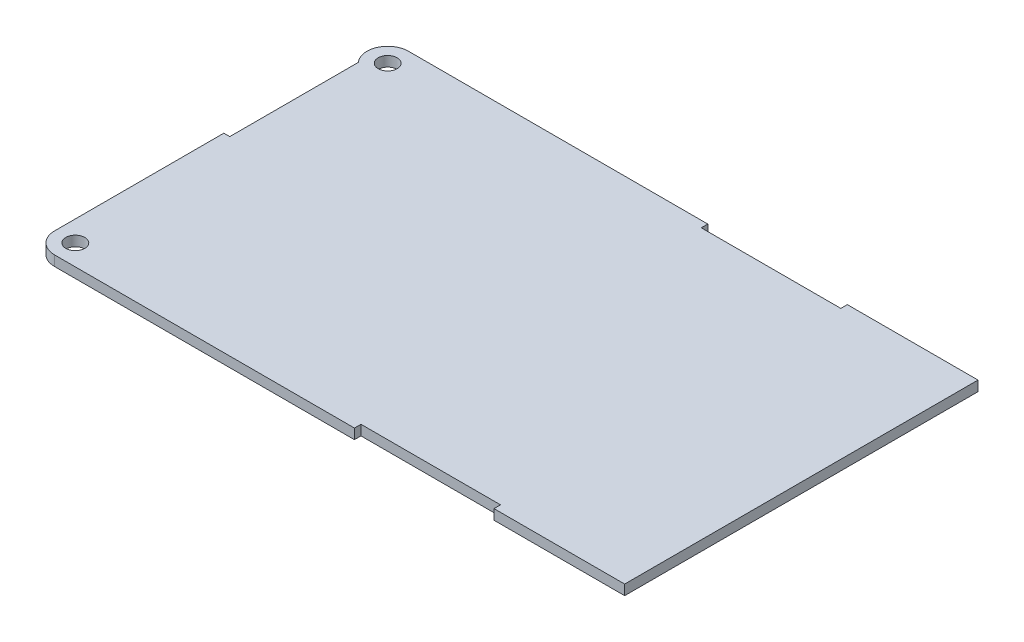
ISO-10303-21;
HEADER;
FILE_DESCRIPTION(('STEP AP214'),'2;1');
FILE_NAME('part.step','',(''),(''),'','','');
FILE_SCHEMA(('AUTOMOTIVE_DESIGN { 1 0 10303 214 1 1 1 1 }'));
ENDSEC;
DATA;
#1=APPLICATION_CONTEXT('core data for automotive mechanical design processes');
#2=APPLICATION_PROTOCOL_DEFINITION('international standard','automotive_design',2000,#1);
#3=PRODUCT_CONTEXT('',#1,'mechanical');
#4=PRODUCT('Part','Part','',(#3));
#5=PRODUCT_RELATED_PRODUCT_CATEGORY('part','',(#4));
#6=PRODUCT_DEFINITION_FORMATION('','',#4);
#7=PRODUCT_DEFINITION_CONTEXT('part definition',#1,'design');
#8=PRODUCT_DEFINITION('design','',#6,#7);
#9=PRODUCT_DEFINITION_SHAPE('','',#8);
#10=(LENGTH_UNIT() NAMED_UNIT(*) SI_UNIT(.MILLI.,.METRE.));
#11=(NAMED_UNIT(*) PLANE_ANGLE_UNIT() SI_UNIT($,.RADIAN.));
#12=(NAMED_UNIT(*) SI_UNIT($,.STERADIAN.) SOLID_ANGLE_UNIT());
#13=UNCERTAINTY_MEASURE_WITH_UNIT(LENGTH_MEASURE(1.E-05),#10,'distance_accuracy_value','');
#14=(GEOMETRIC_REPRESENTATION_CONTEXT(3) GLOBAL_UNCERTAINTY_ASSIGNED_CONTEXT((#13)) GLOBAL_UNIT_ASSIGNED_CONTEXT((#10,
#11,#12)) REPRESENTATION_CONTEXT('',''));
#15=CARTESIAN_POINT('',(0.,0.,0.));
#16=DIRECTION('',(0.,0.,1.));
#17=DIRECTION('',(1.,0.,0.));
#18=AXIS2_PLACEMENT_3D('',#15,#16,#17);
#19=CARTESIAN_POINT('',(0.,1.7,-59.5));
#20=DIRECTION('',(0.,0.,-1.));
#21=DIRECTION('',(-1.,0.,0.));
#22=AXIS2_PLACEMENT_3D('',#19,#20,#21);
#23=PLANE('',#22);
#24=DIRECTION('',(1.,0.,0.));
#25=VECTOR('',#24,1.);
#26=CARTESIAN_POINT('',(0.,0.,-59.5));
#27=LINE('',#26,#25);
#28=CARTESIAN_POINT('',(3.6,0.,-59.5));
#29=VERTEX_POINT('',#28);
#30=CARTESIAN_POINT('',(54.,0.,-59.5));
#31=VERTEX_POINT('',#30);
#32=EDGE_CURVE('E221',#29,#31,#27,.T.);
#33=ORIENTED_EDGE('',*,*,#32,.F.);
#34=DIRECTION('',(0.,-1.,0.));
#35=VECTOR('',#34,1.);
#36=CARTESIAN_POINT('',(3.6,1.7,-59.5));
#37=LINE('',#36,#35);
#38=CARTESIAN_POINT('',(3.6,1.7,-59.5));
#39=VERTEX_POINT('',#38);
#40=EDGE_CURVE('E11',#39,#29,#37,.T.);
#41=ORIENTED_EDGE('',*,*,#40,.F.);
#42=DIRECTION('',(1.,0.,0.));
#43=VECTOR('',#42,1.);
#44=CARTESIAN_POINT('',(0.,1.7,-59.5));
#45=LINE('',#44,#43);
#46=CARTESIAN_POINT('',(54.,1.7,-59.5));
#47=VERTEX_POINT('',#46);
#48=EDGE_CURVE('E348',#39,#47,#45,.T.);
#49=ORIENTED_EDGE('',*,*,#48,.T.);
#50=DIRECTION('',(0.,-1.,0.));
#51=VECTOR('',#50,1.);
#52=CARTESIAN_POINT('',(54.,1.7,-59.5));
#53=LINE('',#52,#51);
#54=EDGE_CURVE('E111',#47,#31,#53,.T.);
#55=ORIENTED_EDGE('',*,*,#54,.T.);
#56=EDGE_LOOP('',(#33,#41,#49,#55));
#57=FACE_BOUND('',#56,.T.);
#58=ADVANCED_FACE('F36',(#57),#23,.T.);
#59=CARTESIAN_POINT('',(3.6,1.7,-56.));
#60=DIRECTION('',(0.,-1.,0.));
#61=DIRECTION('',(0.,0.,-1.));
#62=AXIS2_PLACEMENT_3D('',#59,#60,#61);
#63=CYLINDRICAL_SURFACE('',#62,3.5);
#64=CARTESIAN_POINT('',(3.6,0.,-56.));
#65=DIRECTION('',(0.,1.,0.));
#66=DIRECTION('',(0.,0.,1.));
#67=AXIS2_PLACEMENT_3D('',#64,#65,#66);
#68=CIRCLE('',#67,3.5);
#69=CARTESIAN_POINT('',(1.,0.,-53.656925097228));
#70=VERTEX_POINT('',#69);
#71=EDGE_CURVE('E219',#29,#70,#68,.T.);
#72=ORIENTED_EDGE('',*,*,#71,.T.);
#73=DIRECTION('',(0.,-1.,0.));
#74=VECTOR('',#73,1.);
#75=CARTESIAN_POINT('',(1.,1.7,-53.656925097228));
#76=LINE('',#75,#74);
#77=CARTESIAN_POINT('',(1.,1.7,-53.656925097228));
#78=VERTEX_POINT('',#77);
#79=EDGE_CURVE('E45',#78,#70,#76,.T.);
#80=ORIENTED_EDGE('',*,*,#79,.F.);
#81=CARTESIAN_POINT('',(3.6,1.7,-56.));
#82=DIRECTION('',(0.,1.,0.));
#83=DIRECTION('',(0.,0.,1.));
#84=AXIS2_PLACEMENT_3D('',#81,#82,#83);
#85=CIRCLE('',#84,3.5);
#86=EDGE_CURVE('E350',#39,#78,#85,.T.);
#87=ORIENTED_EDGE('',*,*,#86,.F.);
#88=ORIENTED_EDGE('',*,*,#40,.T.);
#89=EDGE_LOOP('',(#72,#80,#87,#88));
#90=FACE_BOUND('',#89,.T.);
#91=ADVANCED_FACE('F220',(#90),#63,.T.);
#92=CARTESIAN_POINT('',(1.00000000000001,1.7,0.));
#93=DIRECTION('',(1.,0.,0.));
#94=DIRECTION('',(0.,0.,-1.));
#95=AXIS2_PLACEMENT_3D('',#92,#93,#94);
#96=PLANE('',#95);
#97=DIRECTION('',(0.,0.,1.));
#98=VECTOR('',#97,1.);
#99=CARTESIAN_POINT('',(1.00000000000001,0.,0.));
#100=LINE('',#99,#98);
#101=CARTESIAN_POINT('',(1.,0.,-32.));
#102=VERTEX_POINT('',#101);
#103=EDGE_CURVE('E213',#70,#102,#100,.T.);
#104=ORIENTED_EDGE('',*,*,#103,.T.);
#105=DIRECTION('',(0.,-1.,0.));
#106=VECTOR('',#105,1.);
#107=CARTESIAN_POINT('',(1.,1.7,-32.));
#108=LINE('',#107,#106);
#109=CARTESIAN_POINT('',(1.,1.7,-32.));
#110=VERTEX_POINT('',#109);
#111=EDGE_CURVE('E204',#110,#102,#108,.T.);
#112=ORIENTED_EDGE('',*,*,#111,.F.);
#113=DIRECTION('',(0.,0.,1.));
#114=VECTOR('',#113,1.);
#115=CARTESIAN_POINT('',(1.00000000000001,1.7,0.));
#116=LINE('',#115,#114);
#117=EDGE_CURVE('E215',#78,#110,#116,.T.);
#118=ORIENTED_EDGE('',*,*,#117,.F.);
#119=ORIENTED_EDGE('',*,*,#79,.T.);
#120=EDGE_LOOP('',(#104,#112,#118,#119));
#121=FACE_BOUND('',#120,.T.);
#122=ADVANCED_FACE('F211',(#121),#96,.F.);
#123=CARTESIAN_POINT('',(0.,1.7,-32.));
#124=DIRECTION('',(0.,0.,1.));
#125=DIRECTION('',(1.,0.,0.));
#126=AXIS2_PLACEMENT_3D('',#123,#124,#125);
#127=PLANE('',#126);
#128=DIRECTION('',(-1.,0.,0.));
#129=VECTOR('',#128,1.);
#130=CARTESIAN_POINT('',(0.,0.,-32.));
#131=LINE('',#130,#129);
#132=CARTESIAN_POINT('',(0.,0.,-32.));
#133=VERTEX_POINT('',#132);
#134=EDGE_CURVE('E223',#102,#133,#131,.T.);
#135=ORIENTED_EDGE('',*,*,#134,.T.);
#136=DIRECTION('',(0.,-1.,0.));
#137=VECTOR('',#136,1.);
#138=CARTESIAN_POINT('',(0.,1.7,-32.));
#139=LINE('',#138,#137);
#140=CARTESIAN_POINT('',(0.,1.7,-32.));
#141=VERTEX_POINT('',#140);
#142=EDGE_CURVE('E202',#141,#133,#139,.T.);
#143=ORIENTED_EDGE('',*,*,#142,.F.);
#144=DIRECTION('',(-1.,0.,0.));
#145=VECTOR('',#144,1.);
#146=CARTESIAN_POINT('',(0.,1.7,-32.));
#147=LINE('',#146,#145);
#148=EDGE_CURVE('E356',#110,#141,#147,.T.);
#149=ORIENTED_EDGE('',*,*,#148,.F.);
#150=ORIENTED_EDGE('',*,*,#111,.T.);
#151=EDGE_LOOP('',(#135,#143,#149,#150));
#152=FACE_BOUND('',#151,.T.);
#153=ADVANCED_FACE('F291',(#152),#127,.F.);
#154=CARTESIAN_POINT('',(0.,1.7,0.));
#155=DIRECTION('',(-1.,0.,0.));
#156=DIRECTION('',(0.,0.,1.));
#157=AXIS2_PLACEMENT_3D('',#154,#155,#156);
#158=PLANE('',#157);
#159=DIRECTION('',(0.,0.,-1.));
#160=VECTOR('',#159,1.);
#161=CARTESIAN_POINT('',(0.,0.,0.));
#162=LINE('',#161,#160);
#163=CARTESIAN_POINT('',(0.,0.,-3.50000000000002));
#164=VERTEX_POINT('',#163);
#165=EDGE_CURVE('E231',#164,#133,#162,.T.);
#166=ORIENTED_EDGE('',*,*,#165,.F.);
#167=DIRECTION('',(0.,-1.,0.));
#168=VECTOR('',#167,1.);
#169=CARTESIAN_POINT('',(0.,1.7,-3.50000000000002));
#170=LINE('',#169,#168);
#171=CARTESIAN_POINT('',(0.,1.7,-3.50000000000002));
#172=VERTEX_POINT('',#171);
#173=EDGE_CURVE('E200',#172,#164,#170,.T.);
#174=ORIENTED_EDGE('',*,*,#173,.F.);
#175=DIRECTION('',(0.,0.,-1.));
#176=VECTOR('',#175,1.);
#177=CARTESIAN_POINT('',(0.,1.7,0.));
#178=LINE('',#177,#176);
#179=EDGE_CURVE('E358',#172,#141,#178,.T.);
#180=ORIENTED_EDGE('',*,*,#179,.T.);
#181=ORIENTED_EDGE('',*,*,#142,.T.);
#182=EDGE_LOOP('',(#166,#174,#180,#181));
#183=FACE_BOUND('',#182,.T.);
#184=ADVANCED_FACE('F294',(#183),#158,.T.);
#185=CARTESIAN_POINT('',(3.5,1.7,-3.5));
#186=DIRECTION('',(0.,-1.,0.));
#187=DIRECTION('',(0.,0.,-1.));
#188=AXIS2_PLACEMENT_3D('',#185,#186,#187);
#189=CYLINDRICAL_SURFACE('',#188,3.5);
#190=CARTESIAN_POINT('',(3.5,0.,-3.5));
#191=DIRECTION('',(0.,1.,0.));
#192=DIRECTION('',(0.,0.,1.));
#193=AXIS2_PLACEMENT_3D('',#190,#191,#192);
#194=CIRCLE('',#193,3.5);
#195=CARTESIAN_POINT('',(3.50000000000002,0.,0.));
#196=VERTEX_POINT('',#195);
#197=EDGE_CURVE('E234',#196,#164,#194,.F.);
#198=ORIENTED_EDGE('',*,*,#197,.F.);
#199=DIRECTION('',(0.,-1.,0.));
#200=VECTOR('',#199,1.);
#201=CARTESIAN_POINT('',(3.50000000000002,1.7,0.));
#202=LINE('',#201,#200);
#203=CARTESIAN_POINT('',(3.50000000000002,1.7,0.));
#204=VERTEX_POINT('',#203);
#205=EDGE_CURVE('E198',#204,#196,#202,.T.);
#206=ORIENTED_EDGE('',*,*,#205,.F.);
#207=CARTESIAN_POINT('',(3.5,1.7,-3.5));
#208=DIRECTION('',(0.,1.,0.));
#209=DIRECTION('',(0.,0.,1.));
#210=AXIS2_PLACEMENT_3D('',#207,#208,#209);
#211=CIRCLE('',#210,3.5);
#212=EDGE_CURVE('E361',#204,#172,#211,.F.);
#213=ORIENTED_EDGE('',*,*,#212,.T.);
#214=ORIENTED_EDGE('',*,*,#173,.T.);
#215=EDGE_LOOP('',(#198,#206,#213,#214));
#216=FACE_BOUND('',#215,.T.);
#217=ADVANCED_FACE('F298',(#216),#189,.T.);
#218=CARTESIAN_POINT('',(0.,1.7,0.));
#219=DIRECTION('',(0.,0.,-1.));
#220=DIRECTION('',(-1.,0.,0.));
#221=AXIS2_PLACEMENT_3D('',#218,#219,#220);
#222=PLANE('',#221);
#223=DIRECTION('',(1.,0.,0.));
#224=VECTOR('',#223,1.);
#225=CARTESIAN_POINT('',(0.,0.,0.));
#226=LINE('',#225,#224);
#227=CARTESIAN_POINT('',(54.,0.,0.));
#228=VERTEX_POINT('',#227);
#229=EDGE_CURVE('E237',#196,#228,#226,.T.);
#230=ORIENTED_EDGE('',*,*,#229,.T.);
#231=DIRECTION('',(0.,-1.,0.));
#232=VECTOR('',#231,1.);
#233=CARTESIAN_POINT('',(54.,1.7,0.));
#234=LINE('',#233,#232);
#235=CARTESIAN_POINT('',(54.,1.7,0.));
#236=VERTEX_POINT('',#235);
#237=EDGE_CURVE('E195',#236,#228,#234,.T.);
#238=ORIENTED_EDGE('',*,*,#237,.F.);
#239=DIRECTION('',(1.,0.,0.));
#240=VECTOR('',#239,1.);
#241=CARTESIAN_POINT('',(0.,1.7,0.));
#242=LINE('',#241,#240);
#243=EDGE_CURVE('E364',#204,#236,#242,.T.);
#244=ORIENTED_EDGE('',*,*,#243,.F.);
#245=ORIENTED_EDGE('',*,*,#205,.T.);
#246=EDGE_LOOP('',(#230,#238,#244,#245));
#247=FACE_BOUND('',#246,.T.);
#248=ADVANCED_FACE('F302',(#247),#222,.F.);
#249=CARTESIAN_POINT('',(54.,1.7,0.));
#250=DIRECTION('',(-1.,0.,0.));
#251=DIRECTION('',(0.,0.,1.));
#252=AXIS2_PLACEMENT_3D('',#249,#250,#251);
#253=PLANE('',#252);
#254=DIRECTION('',(0.,0.,-1.));
#255=VECTOR('',#254,1.);
#256=CARTESIAN_POINT('',(54.,0.,0.));
#257=LINE('',#256,#255);
#258=CARTESIAN_POINT('',(54.,0.,-1.1));
#259=VERTEX_POINT('',#258);
#260=EDGE_CURVE('E240',#228,#259,#257,.T.);
#261=ORIENTED_EDGE('',*,*,#260,.T.);
#262=DIRECTION('',(0.,-1.,0.));
#263=VECTOR('',#262,1.);
#264=CARTESIAN_POINT('',(54.,1.7,-1.1));
#265=LINE('',#264,#263);
#266=CARTESIAN_POINT('',(54.,1.7,-1.1));
#267=VERTEX_POINT('',#266);
#268=EDGE_CURVE('E192',#267,#259,#265,.T.);
#269=ORIENTED_EDGE('',*,*,#268,.F.);
#270=DIRECTION('',(0.,0.,-1.));
#271=VECTOR('',#270,1.);
#272=CARTESIAN_POINT('',(54.,1.7,0.));
#273=LINE('',#272,#271);
#274=EDGE_CURVE('E367',#236,#267,#273,.T.);
#275=ORIENTED_EDGE('',*,*,#274,.F.);
#276=ORIENTED_EDGE('',*,*,#237,.T.);
#277=EDGE_LOOP('',(#261,#269,#275,#276));
#278=FACE_BOUND('',#277,.T.);
#279=ADVANCED_FACE('F306',(#278),#253,.F.);
#280=CARTESIAN_POINT('',(0.,1.7,-1.09999999999999));
#281=DIRECTION('',(0.,0.,-1.));
#282=DIRECTION('',(-1.,0.,0.));
#283=AXIS2_PLACEMENT_3D('',#280,#281,#282);
#284=PLANE('',#283);
#285=DIRECTION('',(1.,0.,0.));
#286=VECTOR('',#285,1.);
#287=CARTESIAN_POINT('',(0.,0.,-1.09999999999999));
#288=LINE('',#287,#286);
#289=CARTESIAN_POINT('',(77.5,0.,-1.1));
#290=VERTEX_POINT('',#289);
#291=EDGE_CURVE('E243',#259,#290,#288,.T.);
#292=ORIENTED_EDGE('',*,*,#291,.T.);
#293=DIRECTION('',(0.,-1.,0.));
#294=VECTOR('',#293,1.);
#295=CARTESIAN_POINT('',(77.5,1.7,-1.1));
#296=LINE('',#295,#294);
#297=CARTESIAN_POINT('',(77.5,1.7,-1.1));
#298=VERTEX_POINT('',#297);
#299=EDGE_CURVE('E189',#298,#290,#296,.T.);
#300=ORIENTED_EDGE('',*,*,#299,.F.);
#301=DIRECTION('',(1.,0.,0.));
#302=VECTOR('',#301,1.);
#303=CARTESIAN_POINT('',(0.,1.7,-1.09999999999999));
#304=LINE('',#303,#302);
#305=EDGE_CURVE('E370',#267,#298,#304,.T.);
#306=ORIENTED_EDGE('',*,*,#305,.F.);
#307=ORIENTED_EDGE('',*,*,#268,.T.);
#308=EDGE_LOOP('',(#292,#300,#306,#307));
#309=FACE_BOUND('',#308,.T.);
#310=ADVANCED_FACE('F310',(#309),#284,.F.);
#311=CARTESIAN_POINT('',(77.5,1.7,0.));
#312=DIRECTION('',(1.,0.,0.));
#313=DIRECTION('',(0.,0.,-1.));
#314=AXIS2_PLACEMENT_3D('',#311,#312,#313);
#315=PLANE('',#314);
#316=DIRECTION('',(0.,0.,1.));
#317=VECTOR('',#316,1.);
#318=CARTESIAN_POINT('',(77.5,0.,0.));
#319=LINE('',#318,#317);
#320=CARTESIAN_POINT('',(77.5,0.,0.));
#321=VERTEX_POINT('',#320);
#322=EDGE_CURVE('E246',#290,#321,#319,.T.);
#323=ORIENTED_EDGE('',*,*,#322,.T.);
#324=DIRECTION('',(0.,-1.,0.));
#325=VECTOR('',#324,1.);
#326=CARTESIAN_POINT('',(77.5,1.7,0.));
#327=LINE('',#326,#325);
#328=CARTESIAN_POINT('',(77.5,1.7,0.));
#329=VERTEX_POINT('',#328);
#330=EDGE_CURVE('E186',#329,#321,#327,.T.);
#331=ORIENTED_EDGE('',*,*,#330,.F.);
#332=DIRECTION('',(0.,0.,1.));
#333=VECTOR('',#332,1.);
#334=CARTESIAN_POINT('',(77.5,1.7,0.));
#335=LINE('',#334,#333);
#336=EDGE_CURVE('E373',#298,#329,#335,.T.);
#337=ORIENTED_EDGE('',*,*,#336,.F.);
#338=ORIENTED_EDGE('',*,*,#299,.T.);
#339=EDGE_LOOP('',(#323,#331,#337,#338));
#340=FACE_BOUND('',#339,.T.);
#341=ADVANCED_FACE('F314',(#340),#315,.F.);
#342=CARTESIAN_POINT('',(0.,1.7,0.));
#343=DIRECTION('',(0.,0.,-1.));
#344=DIRECTION('',(-1.,0.,0.));
#345=AXIS2_PLACEMENT_3D('',#342,#343,#344);
#346=PLANE('',#345);
#347=DIRECTION('',(1.,0.,0.));
#348=VECTOR('',#347,1.);
#349=CARTESIAN_POINT('',(0.,0.,0.));
#350=LINE('',#349,#348);
#351=CARTESIAN_POINT('',(99.5,0.,0.));
#352=VERTEX_POINT('',#351);
#353=EDGE_CURVE('E249',#321,#352,#350,.T.);
#354=ORIENTED_EDGE('',*,*,#353,.T.);
#355=DIRECTION('',(0.,-1.,0.));
#356=VECTOR('',#355,1.);
#357=CARTESIAN_POINT('',(99.5,1.7,0.));
#358=LINE('',#357,#356);
#359=CARTESIAN_POINT('',(99.5,1.7,0.));
#360=VERTEX_POINT('',#359);
#361=EDGE_CURVE('E183',#360,#352,#358,.T.);
#362=ORIENTED_EDGE('',*,*,#361,.F.);
#363=DIRECTION('',(1.,0.,0.));
#364=VECTOR('',#363,1.);
#365=CARTESIAN_POINT('',(0.,1.7,0.));
#366=LINE('',#365,#364);
#367=EDGE_CURVE('E376',#329,#360,#366,.T.);
#368=ORIENTED_EDGE('',*,*,#367,.F.);
#369=ORIENTED_EDGE('',*,*,#330,.T.);
#370=EDGE_LOOP('',(#354,#362,#368,#369));
#371=FACE_BOUND('',#370,.T.);
#372=ADVANCED_FACE('F318',(#371),#346,.F.);
#373=CARTESIAN_POINT('',(99.5,1.7,0.));
#374=DIRECTION('',(-1.,0.,0.));
#375=DIRECTION('',(0.,0.,1.));
#376=AXIS2_PLACEMENT_3D('',#373,#374,#375);
#377=PLANE('',#376);
#378=DIRECTION('',(0.,0.,-1.));
#379=VECTOR('',#378,1.);
#380=CARTESIAN_POINT('',(99.5,0.,0.));
#381=LINE('',#380,#379);
#382=CARTESIAN_POINT('',(99.5,0.,-59.5));
#383=VERTEX_POINT('',#382);
#384=EDGE_CURVE('E252',#352,#383,#381,.T.);
#385=ORIENTED_EDGE('',*,*,#384,.T.);
#386=DIRECTION('',(0.,-1.,0.));
#387=VECTOR('',#386,1.);
#388=CARTESIAN_POINT('',(99.5,1.7,-59.5));
#389=LINE('',#388,#387);
#390=CARTESIAN_POINT('',(99.5,1.7,-59.5));
#391=VERTEX_POINT('',#390);
#392=EDGE_CURVE('E177',#391,#383,#389,.T.);
#393=ORIENTED_EDGE('',*,*,#392,.F.);
#394=DIRECTION('',(0.,0.,-1.));
#395=VECTOR('',#394,1.);
#396=CARTESIAN_POINT('',(99.5,1.7,0.));
#397=LINE('',#396,#395);
#398=EDGE_CURVE('E379',#360,#391,#397,.T.);
#399=ORIENTED_EDGE('',*,*,#398,.F.);
#400=ORIENTED_EDGE('',*,*,#361,.T.);
#401=EDGE_LOOP('',(#385,#393,#399,#400));
#402=FACE_BOUND('',#401,.T.);
#403=ADVANCED_FACE('F322',(#402),#377,.F.);
#404=CARTESIAN_POINT('',(0.,1.7,-59.5));
#405=DIRECTION('',(0.,0.,-1.));
#406=DIRECTION('',(-1.,0.,0.));
#407=AXIS2_PLACEMENT_3D('',#404,#405,#406);
#408=PLANE('',#407);
#409=DIRECTION('',(1.,0.,0.));
#410=VECTOR('',#409,1.);
#411=CARTESIAN_POINT('',(0.,0.,-59.5));
#412=LINE('',#411,#410);
#413=CARTESIAN_POINT('',(77.5,0.,-59.5));
#414=VERTEX_POINT('',#413);
#415=EDGE_CURVE('E255',#414,#383,#412,.T.);
#416=ORIENTED_EDGE('',*,*,#415,.F.);
#417=DIRECTION('',(0.,-1.,0.));
#418=VECTOR('',#417,1.);
#419=CARTESIAN_POINT('',(77.5,1.7,-59.5));
#420=LINE('',#419,#418);
#421=CARTESIAN_POINT('',(77.5,1.7,-59.5));
#422=VERTEX_POINT('',#421);
#423=EDGE_CURVE('E175',#422,#414,#420,.T.);
#424=ORIENTED_EDGE('',*,*,#423,.F.);
#425=DIRECTION('',(1.,0.,0.));
#426=VECTOR('',#425,1.);
#427=CARTESIAN_POINT('',(0.,1.7,-59.5));
#428=LINE('',#427,#426);
#429=EDGE_CURVE('E169',#422,#391,#428,.T.);
#430=ORIENTED_EDGE('',*,*,#429,.T.);
#431=ORIENTED_EDGE('',*,*,#392,.T.);
#432=EDGE_LOOP('',(#416,#424,#430,#431));
#433=FACE_BOUND('',#432,.T.);
#434=ADVANCED_FACE('F326',(#433),#408,.T.);
#435=CARTESIAN_POINT('',(77.5,1.7,0.));
#436=DIRECTION('',(1.,0.,0.));
#437=DIRECTION('',(0.,0.,-1.));
#438=AXIS2_PLACEMENT_3D('',#435,#436,#437);
#439=PLANE('',#438);
#440=DIRECTION('',(0.,0.,1.));
#441=VECTOR('',#440,1.);
#442=CARTESIAN_POINT('',(77.5,0.,0.));
#443=LINE('',#442,#441);
#444=CARTESIAN_POINT('',(77.5,0.,-58.4));
#445=VERTEX_POINT('',#444);
#446=EDGE_CURVE('E174',#414,#445,#443,.T.);
#447=ORIENTED_EDGE('',*,*,#446,.T.);
#448=DIRECTION('',(0.,-1.,0.));
#449=VECTOR('',#448,1.);
#450=CARTESIAN_POINT('',(77.5,1.7,-58.4));
#451=LINE('',#450,#449);
#452=CARTESIAN_POINT('',(77.5,1.7,-58.4));
#453=VERTEX_POINT('',#452);
#454=EDGE_CURVE('E160',#453,#445,#451,.T.);
#455=ORIENTED_EDGE('',*,*,#454,.F.);
#456=DIRECTION('',(0.,0.,1.));
#457=VECTOR('',#456,1.);
#458=CARTESIAN_POINT('',(77.5,1.7,0.));
#459=LINE('',#458,#457);
#460=EDGE_CURVE('E163',#422,#453,#459,.T.);
#461=ORIENTED_EDGE('',*,*,#460,.F.);
#462=ORIENTED_EDGE('',*,*,#423,.T.);
#463=EDGE_LOOP('',(#447,#455,#461,#462));
#464=FACE_BOUND('',#463,.T.);
#465=ADVANCED_FACE('F172',(#464),#439,.F.);
#466=CARTESIAN_POINT('',(0.,1.7,-58.4));
#467=DIRECTION('',(0.,0.,1.));
#468=DIRECTION('',(1.,0.,0.));
#469=AXIS2_PLACEMENT_3D('',#466,#467,#468);
#470=PLANE('',#469);
#471=DIRECTION('',(-1.,0.,0.));
#472=VECTOR('',#471,1.);
#473=CARTESIAN_POINT('',(0.,0.,-58.4));
#474=LINE('',#473,#472);
#475=CARTESIAN_POINT('',(54.,0.,-58.4));
#476=VERTEX_POINT('',#475);
#477=EDGE_CURVE('E259',#445,#476,#474,.T.);
#478=ORIENTED_EDGE('',*,*,#477,.T.);
#479=DIRECTION('',(0.,-1.,0.));
#480=VECTOR('',#479,1.);
#481=CARTESIAN_POINT('',(54.,1.7,-58.4));
#482=LINE('',#481,#480);
#483=CARTESIAN_POINT('',(54.,1.7,-58.4));
#484=VERTEX_POINT('',#483);
#485=EDGE_CURVE('E162',#484,#476,#482,.T.);
#486=ORIENTED_EDGE('',*,*,#485,.F.);
#487=DIRECTION('',(-1.,0.,0.));
#488=VECTOR('',#487,1.);
#489=CARTESIAN_POINT('',(0.,1.7,-58.4));
#490=LINE('',#489,#488);
#491=EDGE_CURVE('E155',#453,#484,#490,.T.);
#492=ORIENTED_EDGE('',*,*,#491,.F.);
#493=ORIENTED_EDGE('',*,*,#454,.T.);
#494=EDGE_LOOP('',(#478,#486,#492,#493));
#495=FACE_BOUND('',#494,.T.);
#496=ADVANCED_FACE('F158',(#495),#470,.F.);
#497=CARTESIAN_POINT('',(3.5,1.7,-3.5));
#498=DIRECTION('',(0.,-1.,0.));
#499=DIRECTION('',(0.,0.,-1.));
#500=AXIS2_PLACEMENT_3D('',#497,#498,#499);
#501=CYLINDRICAL_SURFACE('',#500,1.6);
#502=CARTESIAN_POINT('',(3.5,1.7,-3.5));
#503=DIRECTION('',(0.,1.,0.));
#504=DIRECTION('',(0.,0.,1.));
#505=AXIS2_PLACEMENT_3D('',#502,#503,#504);
#506=CIRCLE('',#505,1.6);
#507=CARTESIAN_POINT('',(3.5,1.7,-1.9));
#508=VERTEX_POINT('',#507);
#509=EDGE_CURVE('E347',#508,#508,#506,.T.);
#510=ORIENTED_EDGE('',*,*,#509,.T.);
#511=EDGE_LOOP('',(#510));
#512=FACE_BOUND('',#511,.T.);
#513=CARTESIAN_POINT('',(3.5,0.,-3.5));
#514=DIRECTION('',(0.,1.,0.));
#515=DIRECTION('',(0.,0.,1.));
#516=AXIS2_PLACEMENT_3D('',#513,#514,#515);
#517=CIRCLE('',#516,1.6);
#518=CARTESIAN_POINT('',(3.5,0.,-1.9));
#519=VERTEX_POINT('',#518);
#520=EDGE_CURVE('E225',#519,#519,#517,.T.);
#521=ORIENTED_EDGE('',*,*,#520,.F.);
#522=EDGE_LOOP('',(#521));
#523=FACE_BOUND('',#522,.T.);
#524=ADVANCED_FACE('F271',(#512,#523),#501,.F.);
#525=CARTESIAN_POINT('',(3.6,1.7,-56.));
#526=DIRECTION('',(0.,-1.,0.));
#527=DIRECTION('',(0.,0.,-1.));
#528=AXIS2_PLACEMENT_3D('',#525,#526,#527);
#529=CYLINDRICAL_SURFACE('',#528,1.59999999999999);
#530=CARTESIAN_POINT('',(3.6,1.7,-56.));
#531=DIRECTION('',(0.,1.,0.));
#532=DIRECTION('',(0.,0.,1.));
#533=AXIS2_PLACEMENT_3D('',#530,#531,#532);
#534=CIRCLE('',#533,1.59999999999999);
#535=CARTESIAN_POINT('',(3.6,1.7,-54.4));
#536=VERTEX_POINT('',#535);
#537=EDGE_CURVE('E261',#536,#536,#534,.T.);
#538=ORIENTED_EDGE('',*,*,#537,.T.);
#539=EDGE_LOOP('',(#538));
#540=FACE_BOUND('',#539,.T.);
#541=CARTESIAN_POINT('',(3.6,0.,-56.));
#542=DIRECTION('',(0.,1.,0.));
#543=DIRECTION('',(0.,0.,1.));
#544=AXIS2_PLACEMENT_3D('',#541,#542,#543);
#545=CIRCLE('',#544,1.59999999999999);
#546=CARTESIAN_POINT('',(3.6,0.,-54.4));
#547=VERTEX_POINT('',#546);
#548=EDGE_CURVE('E264',#547,#547,#545,.T.);
#549=ORIENTED_EDGE('',*,*,#548,.F.);
#550=EDGE_LOOP('',(#549));
#551=FACE_BOUND('',#550,.T.);
#552=ADVANCED_FACE('F38',(#540,#551),#529,.F.);
#553=CARTESIAN_POINT('',(54.,1.7,0.));
#554=DIRECTION('',(-1.,0.,0.));
#555=DIRECTION('',(0.,0.,1.));
#556=AXIS2_PLACEMENT_3D('',#553,#554,#555);
#557=PLANE('',#556);
#558=DIRECTION('',(0.,0.,-1.));
#559=VECTOR('',#558,1.);
#560=CARTESIAN_POINT('',(54.,0.,0.));
#561=LINE('',#560,#559);
#562=EDGE_CURVE('E104',#476,#31,#561,.T.);
#563=ORIENTED_EDGE('',*,*,#562,.T.);
#564=ORIENTED_EDGE('',*,*,#54,.F.);
#565=DIRECTION('',(0.,0.,-1.));
#566=VECTOR('',#565,1.);
#567=CARTESIAN_POINT('',(54.,1.7,0.));
#568=LINE('',#567,#566);
#569=EDGE_CURVE('E53',#484,#47,#568,.T.);
#570=ORIENTED_EDGE('',*,*,#569,.F.);
#571=ORIENTED_EDGE('',*,*,#485,.T.);
#572=EDGE_LOOP('',(#563,#564,#570,#571));
#573=FACE_BOUND('',#572,.T.);
#574=ADVANCED_FACE('F278',(#573),#557,.F.);
#575=CARTESIAN_POINT('',(0.,1.7,0.));
#576=DIRECTION('',(0.,1.,0.));
#577=DIRECTION('',(0.,0.,1.));
#578=AXIS2_PLACEMENT_3D('',#575,#576,#577);
#579=PLANE('',#578);
#580=ORIENTED_EDGE('',*,*,#537,.F.);
#581=EDGE_LOOP('',(#580));
#582=FACE_BOUND('',#581,.T.);
#583=ORIENTED_EDGE('',*,*,#509,.F.);
#584=EDGE_LOOP('',(#583));
#585=FACE_BOUND('',#584,.T.);
#586=ORIENTED_EDGE('',*,*,#48,.F.);
#587=ORIENTED_EDGE('',*,*,#86,.T.);
#588=ORIENTED_EDGE('',*,*,#117,.T.);
#589=ORIENTED_EDGE('',*,*,#148,.T.);
#590=ORIENTED_EDGE('',*,*,#179,.F.);
#591=ORIENTED_EDGE('',*,*,#212,.F.);
#592=ORIENTED_EDGE('',*,*,#243,.T.);
#593=ORIENTED_EDGE('',*,*,#274,.T.);
#594=ORIENTED_EDGE('',*,*,#305,.T.);
#595=ORIENTED_EDGE('',*,*,#336,.T.);
#596=ORIENTED_EDGE('',*,*,#367,.T.);
#597=ORIENTED_EDGE('',*,*,#398,.T.);
#598=ORIENTED_EDGE('',*,*,#429,.F.);
#599=ORIENTED_EDGE('',*,*,#460,.T.);
#600=ORIENTED_EDGE('',*,*,#491,.T.);
#601=ORIENTED_EDGE('',*,*,#569,.T.);
#602=EDGE_LOOP('',(#586,#587,#588,#589,#590,#591,#592,#593,#594,#595,#596,#597,#598,#599,#600,#601));
#603=FACE_BOUND('',#602,.T.);
#604=ADVANCED_FACE('F167',(#582,#585,#603),#579,.T.);
#605=CARTESIAN_POINT('',(0.,0.,0.));
#606=DIRECTION('',(0.,1.,0.));
#607=DIRECTION('',(0.,0.,1.));
#608=AXIS2_PLACEMENT_3D('',#605,#606,#607);
#609=PLANE('',#608);
#610=ORIENTED_EDGE('',*,*,#548,.T.);
#611=EDGE_LOOP('',(#610));
#612=FACE_BOUND('',#611,.T.);
#613=ORIENTED_EDGE('',*,*,#520,.T.);
#614=EDGE_LOOP('',(#613));
#615=FACE_BOUND('',#614,.T.);
#616=ORIENTED_EDGE('',*,*,#32,.T.);
#617=ORIENTED_EDGE('',*,*,#562,.F.);
#618=ORIENTED_EDGE('',*,*,#477,.F.);
#619=ORIENTED_EDGE('',*,*,#446,.F.);
#620=ORIENTED_EDGE('',*,*,#415,.T.);
#621=ORIENTED_EDGE('',*,*,#384,.F.);
#622=ORIENTED_EDGE('',*,*,#353,.F.);
#623=ORIENTED_EDGE('',*,*,#322,.F.);
#624=ORIENTED_EDGE('',*,*,#291,.F.);
#625=ORIENTED_EDGE('',*,*,#260,.F.);
#626=ORIENTED_EDGE('',*,*,#229,.F.);
#627=ORIENTED_EDGE('',*,*,#197,.T.);
#628=ORIENTED_EDGE('',*,*,#165,.T.);
#629=ORIENTED_EDGE('',*,*,#134,.F.);
#630=ORIENTED_EDGE('',*,*,#103,.F.);
#631=ORIENTED_EDGE('',*,*,#71,.F.);
#632=EDGE_LOOP('',(#616,#617,#618,#619,#620,#621,#622,#623,#624,#625,#626,#627,#628,#629,#630,#631));
#633=FACE_BOUND('',#632,.T.);
#634=ADVANCED_FACE('F269',(#612,#615,#633),#609,.F.);
#635=CLOSED_SHELL('',(#58,#91,#122,#153,#184,#217,#248,#279,#310,#341,#372,#403,#434,#465,#496,
#524,#552,#574,#604,#634));
#636=MANIFOLD_SOLID_BREP('B2',#635);
#637=ADVANCED_BREP_SHAPE_REPRESENTATION('',(#18,#636),#14);
#638=SHAPE_DEFINITION_REPRESENTATION(#9,#637);
ENDSEC;
END-ISO-10303-21;
